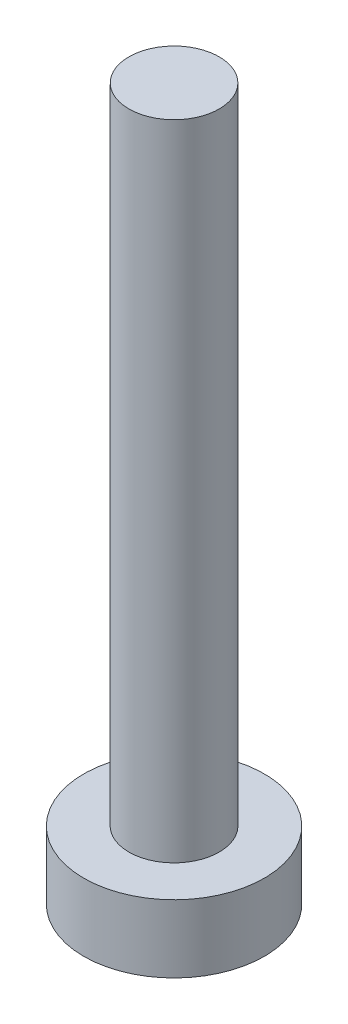
ISO-10303-21;
HEADER;
FILE_DESCRIPTION(('STEP AP214'),'2;1');
FILE_NAME('part.step','',(''),(''),'','','');
FILE_SCHEMA(('AUTOMOTIVE_DESIGN { 1 0 10303 214 1 1 1 1 }'));
ENDSEC;
DATA;
#1=APPLICATION_CONTEXT('core data for automotive mechanical design processes');
#2=APPLICATION_PROTOCOL_DEFINITION('international standard','automotive_design',2000,#1);
#3=PRODUCT_CONTEXT('',#1,'mechanical');
#4=PRODUCT('Part','Part','',(#3));
#5=PRODUCT_RELATED_PRODUCT_CATEGORY('part','',(#4));
#6=PRODUCT_DEFINITION_FORMATION('','',#4);
#7=PRODUCT_DEFINITION_CONTEXT('part definition',#1,'design');
#8=PRODUCT_DEFINITION('design','',#6,#7);
#9=PRODUCT_DEFINITION_SHAPE('','',#8);
#10=(LENGTH_UNIT() NAMED_UNIT(*) SI_UNIT(.MILLI.,.METRE.));
#11=(NAMED_UNIT(*) PLANE_ANGLE_UNIT() SI_UNIT($,.RADIAN.));
#12=(NAMED_UNIT(*) SI_UNIT($,.STERADIAN.) SOLID_ANGLE_UNIT());
#13=UNCERTAINTY_MEASURE_WITH_UNIT(LENGTH_MEASURE(1.E-05),#10,'distance_accuracy_value','');
#14=(GEOMETRIC_REPRESENTATION_CONTEXT(3) GLOBAL_UNCERTAINTY_ASSIGNED_CONTEXT((#13)) GLOBAL_UNIT_ASSIGNED_CONTEXT((#10,
#11,#12)) REPRESENTATION_CONTEXT('',''));
#15=CARTESIAN_POINT('',(0.,0.,0.));
#16=DIRECTION('',(0.,0.,1.));
#17=DIRECTION('',(1.,0.,0.));
#18=AXIS2_PLACEMENT_3D('',#15,#16,#17);
#19=CARTESIAN_POINT('',(0.,3.,0.));
#20=DIRECTION('',(0.,1.,0.));
#21=DIRECTION('',(0.,0.,1.));
#22=AXIS2_PLACEMENT_3D('',#19,#20,#21);
#23=PLANE('',#22);
#24=CARTESIAN_POINT('',(0.,3.,0.));
#25=DIRECTION('',(0.,1.,0.));
#26=DIRECTION('',(0.,0.,1.));
#27=AXIS2_PLACEMENT_3D('',#24,#25,#26);
#28=CIRCLE('',#27,4.);
#29=CARTESIAN_POINT('',(0.,3.,4.));
#30=VERTEX_POINT('',#29);
#31=EDGE_CURVE('E10',#30,#30,#28,.T.);
#32=ORIENTED_EDGE('',*,*,#31,.T.);
#33=EDGE_LOOP('',(#32));
#34=FACE_BOUND('',#33,.T.);
#35=CARTESIAN_POINT('',(0.,3.,0.));
#36=DIRECTION('',(0.,1.,0.));
#37=DIRECTION('',(0.,0.,1.));
#38=AXIS2_PLACEMENT_3D('',#35,#36,#37);
#39=CIRCLE('',#38,2.);
#40=CARTESIAN_POINT('',(0.,3.,2.));
#41=VERTEX_POINT('',#40);
#42=EDGE_CURVE('E45',#41,#41,#39,.T.);
#43=ORIENTED_EDGE('',*,*,#42,.F.);
#44=EDGE_LOOP('',(#43));
#45=FACE_BOUND('',#44,.T.);
#46=ADVANCED_FACE('F34',(#34,#45),#23,.T.);
#47=CARTESIAN_POINT('',(0.,0.,0.));
#48=DIRECTION('',(0.,1.,0.));
#49=DIRECTION('',(0.,0.,1.));
#50=AXIS2_PLACEMENT_3D('',#47,#48,#49);
#51=PLANE('',#50);
#52=CARTESIAN_POINT('',(0.,0.,0.));
#53=DIRECTION('',(0.,1.,0.));
#54=DIRECTION('',(0.,0.,1.));
#55=AXIS2_PLACEMENT_3D('',#52,#53,#54);
#56=CIRCLE('',#55,4.);
#57=CARTESIAN_POINT('',(0.,0.,4.));
#58=VERTEX_POINT('',#57);
#59=EDGE_CURVE('E38',#58,#58,#56,.T.);
#60=ORIENTED_EDGE('',*,*,#59,.F.);
#61=EDGE_LOOP('',(#60));
#62=FACE_BOUND('',#61,.T.);
#63=ADVANCED_FACE('F64',(#62),#51,.F.);
#64=CARTESIAN_POINT('',(0.,3.,0.));
#65=DIRECTION('',(0.,-1.,0.));
#66=DIRECTION('',(0.,0.,-1.));
#67=AXIS2_PLACEMENT_3D('',#64,#65,#66);
#68=CYLINDRICAL_SURFACE('',#67,4.);
#69=ORIENTED_EDGE('',*,*,#31,.F.);
#70=EDGE_LOOP('',(#69));
#71=FACE_BOUND('',#70,.T.);
#72=ORIENTED_EDGE('',*,*,#59,.T.);
#73=EDGE_LOOP('',(#72));
#74=FACE_BOUND('',#73,.T.);
#75=ADVANCED_FACE('F36',(#71,#74),#68,.T.);
#76=CARTESIAN_POINT('',(0.,31.5,0.));
#77=DIRECTION('',(0.,-1.,0.));
#78=DIRECTION('',(0.,0.,-1.));
#79=AXIS2_PLACEMENT_3D('',#76,#77,#78);
#80=CYLINDRICAL_SURFACE('',#79,2.);
#81=ORIENTED_EDGE('',*,*,#42,.T.);
#82=EDGE_LOOP('',(#81));
#83=FACE_BOUND('',#82,.T.);
#84=CARTESIAN_POINT('',(0.,31.5,0.));
#85=DIRECTION('',(0.,1.,0.));
#86=DIRECTION('',(0.,0.,1.));
#87=AXIS2_PLACEMENT_3D('',#84,#85,#86);
#88=CIRCLE('',#87,2.);
#89=CARTESIAN_POINT('',(0.,31.5,2.));
#90=VERTEX_POINT('',#89);
#91=EDGE_CURVE('E49',#90,#90,#88,.T.);
#92=ORIENTED_EDGE('',*,*,#91,.F.);
#93=EDGE_LOOP('',(#92));
#94=FACE_BOUND('',#93,.T.);
#95=ADVANCED_FACE('F55',(#83,#94),#80,.T.);
#96=CARTESIAN_POINT('',(0.,31.5,0.));
#97=DIRECTION('',(0.,1.,0.));
#98=DIRECTION('',(0.,0.,1.));
#99=AXIS2_PLACEMENT_3D('',#96,#97,#98);
#100=PLANE('',#99);
#101=ORIENTED_EDGE('',*,*,#91,.T.);
#102=EDGE_LOOP('',(#101));
#103=FACE_BOUND('',#102,.T.);
#104=ADVANCED_FACE('F53',(#103),#100,.T.);
#105=CLOSED_SHELL('',(#46,#63,#75,#95,#104));
#106=MANIFOLD_SOLID_BREP('B2',#105);
#107=ADVANCED_BREP_SHAPE_REPRESENTATION('',(#18,#106),#14);
#108=SHAPE_DEFINITION_REPRESENTATION(#9,#107);
ENDSEC;
END-ISO-10303-21;
